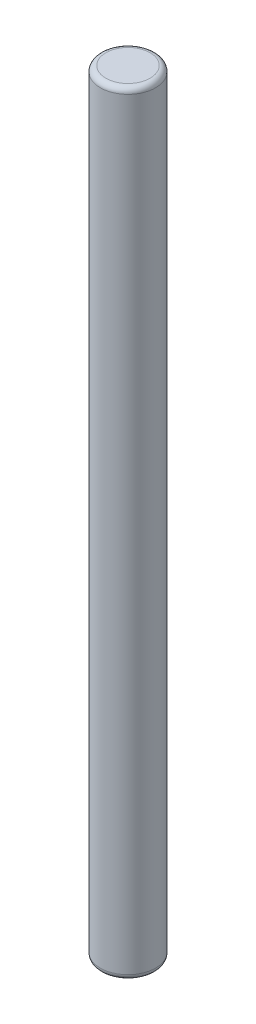
ISO-10303-21;
HEADER;
FILE_DESCRIPTION(('STEP AP214'),'2;1');
FILE_NAME('part.step','',(''),(''),'','','');
FILE_SCHEMA(('AUTOMOTIVE_DESIGN { 1 0 10303 214 1 1 1 1 }'));
ENDSEC;
DATA;
#1=APPLICATION_CONTEXT('core data for automotive mechanical design processes');
#2=APPLICATION_PROTOCOL_DEFINITION('international standard','automotive_design',2000,#1);
#3=PRODUCT_CONTEXT('',#1,'mechanical');
#4=PRODUCT('Part','Part','',(#3));
#5=PRODUCT_RELATED_PRODUCT_CATEGORY('part','',(#4));
#6=PRODUCT_DEFINITION_FORMATION('','',#4);
#7=PRODUCT_DEFINITION_CONTEXT('part definition',#1,'design');
#8=PRODUCT_DEFINITION('design','',#6,#7);
#9=PRODUCT_DEFINITION_SHAPE('','',#8);
#10=(LENGTH_UNIT() NAMED_UNIT(*) SI_UNIT(.MILLI.,.METRE.));
#11=(NAMED_UNIT(*) PLANE_ANGLE_UNIT() SI_UNIT($,.RADIAN.));
#12=(NAMED_UNIT(*) SI_UNIT($,.STERADIAN.) SOLID_ANGLE_UNIT());
#13=UNCERTAINTY_MEASURE_WITH_UNIT(LENGTH_MEASURE(1.E-05),#10,'distance_accuracy_value','');
#14=(GEOMETRIC_REPRESENTATION_CONTEXT(3) GLOBAL_UNCERTAINTY_ASSIGNED_CONTEXT((#13)) GLOBAL_UNIT_ASSIGNED_CONTEXT((#10,
#11,#12)) REPRESENTATION_CONTEXT('',''));
#15=CARTESIAN_POINT('',(0.,0.,0.));
#16=DIRECTION('',(0.,0.,1.));
#17=DIRECTION('',(1.,0.,0.));
#18=AXIS2_PLACEMENT_3D('',#15,#16,#17);
#19=CARTESIAN_POINT('',(0.,70.,0.));
#20=DIRECTION('',(0.,-1.,0.));
#21=DIRECTION('',(0.,0.,-1.));
#22=AXIS2_PLACEMENT_3D('',#19,#20,#21);
#23=CYLINDRICAL_SURFACE('',#22,2.5);
#24=CARTESIAN_POINT('',(0.,69.5,0.));
#25=DIRECTION('',(0.,1.,0.));
#26=DIRECTION('',(0.,0.,1.));
#27=AXIS2_PLACEMENT_3D('',#24,#25,#26);
#28=CIRCLE('',#27,2.5);
#29=CARTESIAN_POINT('',(0.,69.5,2.5));
#30=VERTEX_POINT('',#29);
#31=EDGE_CURVE('E10',#30,#30,#28,.F.);
#32=ORIENTED_EDGE('',*,*,#31,.T.);
#33=EDGE_LOOP('',(#32));
#34=FACE_BOUND('',#33,.T.);
#35=CARTESIAN_POINT('',(0.,0.5,0.));
#36=DIRECTION('',(0.,1.,0.));
#37=DIRECTION('',(0.,0.,1.));
#38=AXIS2_PLACEMENT_3D('',#35,#36,#37);
#39=CIRCLE('',#38,2.5);
#40=CARTESIAN_POINT('',(0.,0.5,2.5));
#41=VERTEX_POINT('',#40);
#42=EDGE_CURVE('E48',#41,#41,#39,.T.);
#43=ORIENTED_EDGE('',*,*,#42,.T.);
#44=EDGE_LOOP('',(#43));
#45=FACE_BOUND('',#44,.T.);
#46=ADVANCED_FACE('F33',(#34,#45),#23,.T.);
#47=CARTESIAN_POINT('',(0.,70.,0.));
#48=DIRECTION('',(0.,1.,0.));
#49=DIRECTION('',(0.,0.,1.));
#50=AXIS2_PLACEMENT_3D('',#47,#48,#49);
#51=PLANE('',#50);
#52=CARTESIAN_POINT('',(0.,70.,0.));
#53=DIRECTION('',(0.,1.,0.));
#54=DIRECTION('',(0.,0.,1.));
#55=AXIS2_PLACEMENT_3D('',#52,#53,#54);
#56=CIRCLE('',#55,2.);
#57=CARTESIAN_POINT('',(0.,70.,2.));
#58=VERTEX_POINT('',#57);
#59=EDGE_CURVE('E40',#58,#58,#56,.T.);
#60=ORIENTED_EDGE('',*,*,#59,.T.);
#61=EDGE_LOOP('',(#60));
#62=FACE_BOUND('',#61,.T.);
#63=ADVANCED_FACE('F64',(#62),#51,.T.);
#64=CARTESIAN_POINT('',(0.,0.,0.));
#65=DIRECTION('',(0.,1.,0.));
#66=DIRECTION('',(0.,0.,1.));
#67=AXIS2_PLACEMENT_3D('',#64,#65,#66);
#68=PLANE('',#67);
#69=CARTESIAN_POINT('',(0.,0.,0.));
#70=DIRECTION('',(0.,1.,0.));
#71=DIRECTION('',(0.,0.,1.));
#72=AXIS2_PLACEMENT_3D('',#69,#70,#71);
#73=CIRCLE('',#72,2.);
#74=CARTESIAN_POINT('',(0.,0.,2.));
#75=VERTEX_POINT('',#74);
#76=EDGE_CURVE('E44',#75,#75,#73,.F.);
#77=ORIENTED_EDGE('',*,*,#76,.T.);
#78=EDGE_LOOP('',(#77));
#79=FACE_BOUND('',#78,.T.);
#80=ADVANCED_FACE('F57',(#79),#68,.F.);
#81=CARTESIAN_POINT('',(0.,0.5,0.));
#82=DIRECTION('',(0.,1.,0.));
#83=DIRECTION('',(0.,0.,1.));
#84=AXIS2_PLACEMENT_3D('',#81,#82,#83);
#85=TOROIDAL_SURFACE('',#84,2.,0.5);
#86=ORIENTED_EDGE('',*,*,#76,.F.);
#87=EDGE_LOOP('',(#86));
#88=FACE_BOUND('',#87,.T.);
#89=ORIENTED_EDGE('',*,*,#42,.F.);
#90=EDGE_LOOP('',(#89));
#91=FACE_BOUND('',#90,.T.);
#92=ADVANCED_FACE('F55',(#88,#91),#85,.T.);
#93=CARTESIAN_POINT('',(0.,69.5,0.));
#94=DIRECTION('',(0.,1.,0.));
#95=DIRECTION('',(0.,0.,1.));
#96=AXIS2_PLACEMENT_3D('',#93,#94,#95);
#97=TOROIDAL_SURFACE('',#96,2.,0.5);
#98=ORIENTED_EDGE('',*,*,#31,.F.);
#99=EDGE_LOOP('',(#98));
#100=FACE_BOUND('',#99,.T.);
#101=ORIENTED_EDGE('',*,*,#59,.F.);
#102=EDGE_LOOP('',(#101));
#103=FACE_BOUND('',#102,.T.);
#104=ADVANCED_FACE('F35',(#100,#103),#97,.T.);
#105=CLOSED_SHELL('',(#46,#63,#80,#92,#104));
#106=MANIFOLD_SOLID_BREP('B2',#105);
#107=ADVANCED_BREP_SHAPE_REPRESENTATION('',(#18,#106),#14);
#108=SHAPE_DEFINITION_REPRESENTATION(#9,#107);
ENDSEC;
END-ISO-10303-21;
